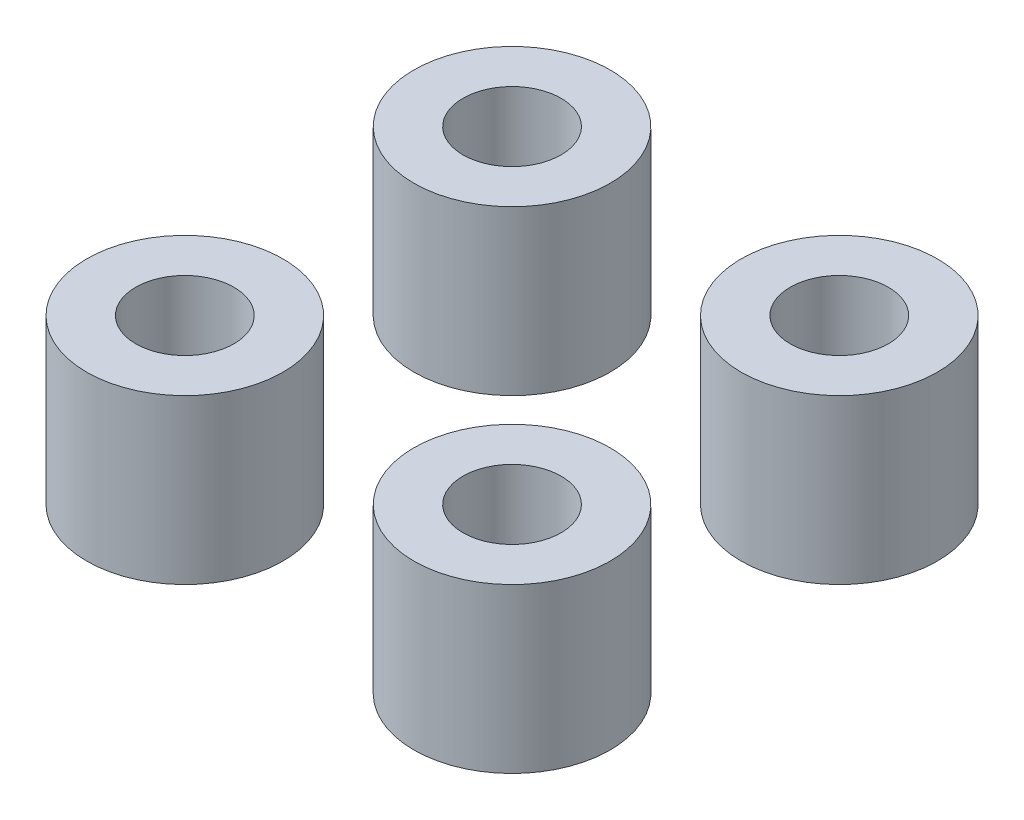
ISO-10303-21;
HEADER;
FILE_DESCRIPTION(('STEP AP214'),'2;1');
FILE_NAME('part.step','',(''),(''),'','','');
FILE_SCHEMA(('AUTOMOTIVE_DESIGN { 1 0 10303 214 1 1 1 1 }'));
ENDSEC;
DATA;
#1=APPLICATION_CONTEXT('core data for automotive mechanical design processes');
#2=APPLICATION_PROTOCOL_DEFINITION('international standard','automotive_design',2000,#1);
#3=PRODUCT_CONTEXT('',#1,'mechanical');
#4=PRODUCT('Part','Part','',(#3));
#5=PRODUCT_RELATED_PRODUCT_CATEGORY('part','',(#4));
#6=PRODUCT_DEFINITION_FORMATION('','',#4);
#7=PRODUCT_DEFINITION_CONTEXT('part definition',#1,'design');
#8=PRODUCT_DEFINITION('design','',#6,#7);
#9=PRODUCT_DEFINITION_SHAPE('','',#8);
#10=(LENGTH_UNIT() NAMED_UNIT(*) SI_UNIT(.MILLI.,.METRE.));
#11=(NAMED_UNIT(*) PLANE_ANGLE_UNIT() SI_UNIT($,.RADIAN.));
#12=(NAMED_UNIT(*) SI_UNIT($,.STERADIAN.) SOLID_ANGLE_UNIT());
#13=UNCERTAINTY_MEASURE_WITH_UNIT(LENGTH_MEASURE(1.E-05),#10,'distance_accuracy_value','');
#14=(GEOMETRIC_REPRESENTATION_CONTEXT(3) GLOBAL_UNCERTAINTY_ASSIGNED_CONTEXT((#13)) GLOBAL_UNIT_ASSIGNED_CONTEXT((#10,
#11,#12)) REPRESENTATION_CONTEXT('',''));
#15=CARTESIAN_POINT('',(0.,0.,0.));
#16=DIRECTION('',(0.,0.,1.));
#17=DIRECTION('',(1.,0.,0.));
#18=AXIS2_PLACEMENT_3D('',#15,#16,#17);
#19=CARTESIAN_POINT('',(20.,10.,0.));
#20=DIRECTION('',(0.,1.,0.));
#21=DIRECTION('',(0.,0.,1.));
#22=AXIS2_PLACEMENT_3D('',#19,#20,#21);
#23=PLANE('',#22);
#24=CARTESIAN_POINT('',(20.,10.,0.));
#25=DIRECTION('',(0.,1.,0.));
#26=DIRECTION('',(0.,0.,1.));
#27=AXIS2_PLACEMENT_3D('',#24,#25,#26);
#28=CIRCLE('',#27,6.);
#29=CARTESIAN_POINT('',(20.,10.,6.));
#30=VERTEX_POINT('',#29);
#31=EDGE_CURVE('E11',#30,#30,#28,.T.);
#32=ORIENTED_EDGE('',*,*,#31,.T.);
#33=EDGE_LOOP('',(#32));
#34=FACE_BOUND('',#33,.T.);
#35=CARTESIAN_POINT('',(20.,10.,0.));
#36=DIRECTION('',(0.,1.,0.));
#37=DIRECTION('',(0.,0.,1.));
#38=AXIS2_PLACEMENT_3D('',#35,#36,#37);
#39=CIRCLE('',#38,3.);
#40=CARTESIAN_POINT('',(20.,10.,3.));
#41=VERTEX_POINT('',#40);
#42=EDGE_CURVE('E53',#41,#41,#39,.T.);
#43=ORIENTED_EDGE('',*,*,#42,.F.);
#44=EDGE_LOOP('',(#43));
#45=FACE_BOUND('',#44,.T.);
#46=ADVANCED_FACE('F42',(#34,#45),#23,.T.);
#47=CARTESIAN_POINT('',(20.,0.,0.));
#48=DIRECTION('',(0.,1.,0.));
#49=DIRECTION('',(0.,0.,1.));
#50=AXIS2_PLACEMENT_3D('',#47,#48,#49);
#51=PLANE('',#50);
#52=CARTESIAN_POINT('',(20.,0.,0.));
#53=DIRECTION('',(0.,1.,0.));
#54=DIRECTION('',(0.,0.,1.));
#55=AXIS2_PLACEMENT_3D('',#52,#53,#54);
#56=CIRCLE('',#55,6.);
#57=CARTESIAN_POINT('',(20.,0.,6.));
#58=VERTEX_POINT('',#57);
#59=EDGE_CURVE('E46',#58,#58,#56,.T.);
#60=ORIENTED_EDGE('',*,*,#59,.F.);
#61=EDGE_LOOP('',(#60));
#62=FACE_BOUND('',#61,.T.);
#63=CARTESIAN_POINT('',(20.,0.,0.));
#64=DIRECTION('',(0.,1.,0.));
#65=DIRECTION('',(0.,0.,1.));
#66=AXIS2_PLACEMENT_3D('',#63,#64,#65);
#67=CIRCLE('',#66,3.);
#68=CARTESIAN_POINT('',(20.,0.,3.));
#69=VERTEX_POINT('',#68);
#70=EDGE_CURVE('E55',#69,#69,#67,.T.);
#71=ORIENTED_EDGE('',*,*,#70,.T.);
#72=EDGE_LOOP('',(#71));
#73=FACE_BOUND('',#72,.T.);
#74=ADVANCED_FACE('F65',(#62,#73),#51,.F.);
#75=CARTESIAN_POINT('',(20.,10.,0.));
#76=DIRECTION('',(0.,-1.,0.));
#77=DIRECTION('',(0.,0.,-1.));
#78=AXIS2_PLACEMENT_3D('',#75,#76,#77);
#79=CYLINDRICAL_SURFACE('',#78,6.);
#80=ORIENTED_EDGE('',*,*,#31,.F.);
#81=EDGE_LOOP('',(#80));
#82=FACE_BOUND('',#81,.T.);
#83=ORIENTED_EDGE('',*,*,#59,.T.);
#84=EDGE_LOOP('',(#83));
#85=FACE_BOUND('',#84,.T.);
#86=ADVANCED_FACE('F44',(#82,#85),#79,.T.);
#87=CARTESIAN_POINT('',(20.,10.,0.));
#88=DIRECTION('',(0.,-1.,0.));
#89=DIRECTION('',(0.,0.,-1.));
#90=AXIS2_PLACEMENT_3D('',#87,#88,#89);
#91=CYLINDRICAL_SURFACE('',#90,3.);
#92=ORIENTED_EDGE('',*,*,#42,.T.);
#93=EDGE_LOOP('',(#92));
#94=FACE_BOUND('',#93,.T.);
#95=ORIENTED_EDGE('',*,*,#70,.F.);
#96=EDGE_LOOP('',(#95));
#97=FACE_BOUND('',#96,.T.);
#98=ADVANCED_FACE('F61',(#94,#97),#91,.F.);
#99=CLOSED_SHELL('',(#46,#74,#86,#98));
#100=MANIFOLD_SOLID_BREP('B2',#99);
#101=CARTESIAN_POINT('',(20.,10.,-20.));
#102=DIRECTION('',(0.,1.,0.));
#103=DIRECTION('',(0.,0.,1.));
#104=AXIS2_PLACEMENT_3D('',#101,#102,#103);
#105=PLANE('',#104);
#106=CARTESIAN_POINT('',(20.,10.,-20.));
#107=DIRECTION('',(0.,1.,0.));
#108=DIRECTION('',(0.,0.,1.));
#109=AXIS2_PLACEMENT_3D('',#106,#107,#108);
#110=CIRCLE('',#109,6.);
#111=CARTESIAN_POINT('',(20.,10.,-14.));
#112=VERTEX_POINT('',#111);
#113=EDGE_CURVE('E41',#112,#112,#110,.T.);
#114=ORIENTED_EDGE('',*,*,#113,.T.);
#115=EDGE_LOOP('',(#114));
#116=FACE_BOUND('',#115,.T.);
#117=CARTESIAN_POINT('',(20.,10.,-20.));
#118=DIRECTION('',(0.,1.,0.));
#119=DIRECTION('',(0.,0.,1.));
#120=AXIS2_PLACEMENT_3D('',#117,#118,#119);
#121=CIRCLE('',#120,3.);
#122=CARTESIAN_POINT('',(20.,10.,-17.));
#123=VERTEX_POINT('',#122);
#124=EDGE_CURVE('E123',#123,#123,#121,.T.);
#125=ORIENTED_EDGE('',*,*,#124,.F.);
#126=EDGE_LOOP('',(#125));
#127=FACE_BOUND('',#126,.T.);
#128=ADVANCED_FACE('F112',(#116,#127),#105,.T.);
#129=CARTESIAN_POINT('',(20.,0.,-20.));
#130=DIRECTION('',(0.,1.,0.));
#131=DIRECTION('',(0.,0.,1.));
#132=AXIS2_PLACEMENT_3D('',#129,#130,#131);
#133=PLANE('',#132);
#134=CARTESIAN_POINT('',(20.,0.,-20.));
#135=DIRECTION('',(0.,1.,0.));
#136=DIRECTION('',(0.,0.,1.));
#137=AXIS2_PLACEMENT_3D('',#134,#135,#136);
#138=CIRCLE('',#137,6.);
#139=CARTESIAN_POINT('',(20.,0.,-14.));
#140=VERTEX_POINT('',#139);
#141=EDGE_CURVE('E116',#140,#140,#138,.T.);
#142=ORIENTED_EDGE('',*,*,#141,.F.);
#143=EDGE_LOOP('',(#142));
#144=FACE_BOUND('',#143,.T.);
#145=CARTESIAN_POINT('',(20.,0.,-20.));
#146=DIRECTION('',(0.,1.,0.));
#147=DIRECTION('',(0.,0.,1.));
#148=AXIS2_PLACEMENT_3D('',#145,#146,#147);
#149=CIRCLE('',#148,3.);
#150=CARTESIAN_POINT('',(20.,0.,-17.));
#151=VERTEX_POINT('',#150);
#152=EDGE_CURVE('E125',#151,#151,#149,.T.);
#153=ORIENTED_EDGE('',*,*,#152,.T.);
#154=EDGE_LOOP('',(#153));
#155=FACE_BOUND('',#154,.T.);
#156=ADVANCED_FACE('F135',(#144,#155),#133,.F.);
#157=CARTESIAN_POINT('',(20.,10.,-20.));
#158=DIRECTION('',(0.,-1.,0.));
#159=DIRECTION('',(0.,0.,-1.));
#160=AXIS2_PLACEMENT_3D('',#157,#158,#159);
#161=CYLINDRICAL_SURFACE('',#160,6.);
#162=ORIENTED_EDGE('',*,*,#113,.F.);
#163=EDGE_LOOP('',(#162));
#164=FACE_BOUND('',#163,.T.);
#165=ORIENTED_EDGE('',*,*,#141,.T.);
#166=EDGE_LOOP('',(#165));
#167=FACE_BOUND('',#166,.T.);
#168=ADVANCED_FACE('F114',(#164,#167),#161,.T.);
#169=CARTESIAN_POINT('',(20.,10.,-20.));
#170=DIRECTION('',(0.,-1.,0.));
#171=DIRECTION('',(0.,0.,-1.));
#172=AXIS2_PLACEMENT_3D('',#169,#170,#171);
#173=CYLINDRICAL_SURFACE('',#172,3.);
#174=ORIENTED_EDGE('',*,*,#124,.T.);
#175=EDGE_LOOP('',(#174));
#176=FACE_BOUND('',#175,.T.);
#177=ORIENTED_EDGE('',*,*,#152,.F.);
#178=EDGE_LOOP('',(#177));
#179=FACE_BOUND('',#178,.T.);
#180=ADVANCED_FACE('F131',(#176,#179),#173,.F.);
#181=CLOSED_SHELL('',(#128,#156,#168,#180));
#182=MANIFOLD_SOLID_BREP('B6',#181);
#183=CARTESIAN_POINT('',(0.,10.,-20.));
#184=DIRECTION('',(0.,1.,0.));
#185=DIRECTION('',(0.,0.,1.));
#186=AXIS2_PLACEMENT_3D('',#183,#184,#185);
#187=PLANE('',#186);
#188=CARTESIAN_POINT('',(0.,10.,-20.));
#189=DIRECTION('',(0.,1.,0.));
#190=DIRECTION('',(0.,0.,1.));
#191=AXIS2_PLACEMENT_3D('',#188,#189,#190);
#192=CIRCLE('',#191,6.);
#193=CARTESIAN_POINT('',(0.,10.,-14.));
#194=VERTEX_POINT('',#193);
#195=EDGE_CURVE('E111',#194,#194,#192,.T.);
#196=ORIENTED_EDGE('',*,*,#195,.T.);
#197=EDGE_LOOP('',(#196));
#198=FACE_BOUND('',#197,.T.);
#199=CARTESIAN_POINT('',(0.,10.,-20.));
#200=DIRECTION('',(0.,1.,0.));
#201=DIRECTION('',(0.,0.,1.));
#202=AXIS2_PLACEMENT_3D('',#199,#200,#201);
#203=CIRCLE('',#202,3.);
#204=CARTESIAN_POINT('',(0.,10.,-17.));
#205=VERTEX_POINT('',#204);
#206=EDGE_CURVE('E192',#205,#205,#203,.T.);
#207=ORIENTED_EDGE('',*,*,#206,.F.);
#208=EDGE_LOOP('',(#207));
#209=FACE_BOUND('',#208,.T.);
#210=ADVANCED_FACE('F181',(#198,#209),#187,.T.);
#211=CARTESIAN_POINT('',(0.,0.,-20.));
#212=DIRECTION('',(0.,1.,0.));
#213=DIRECTION('',(0.,0.,1.));
#214=AXIS2_PLACEMENT_3D('',#211,#212,#213);
#215=PLANE('',#214);
#216=CARTESIAN_POINT('',(0.,0.,-20.));
#217=DIRECTION('',(0.,1.,0.));
#218=DIRECTION('',(0.,0.,1.));
#219=AXIS2_PLACEMENT_3D('',#216,#217,#218);
#220=CIRCLE('',#219,6.);
#221=CARTESIAN_POINT('',(0.,0.,-14.));
#222=VERTEX_POINT('',#221);
#223=EDGE_CURVE('E185',#222,#222,#220,.T.);
#224=ORIENTED_EDGE('',*,*,#223,.F.);
#225=EDGE_LOOP('',(#224));
#226=FACE_BOUND('',#225,.T.);
#227=CARTESIAN_POINT('',(0.,0.,-20.));
#228=DIRECTION('',(0.,1.,0.));
#229=DIRECTION('',(0.,0.,1.));
#230=AXIS2_PLACEMENT_3D('',#227,#228,#229);
#231=CIRCLE('',#230,3.);
#232=CARTESIAN_POINT('',(0.,0.,-17.));
#233=VERTEX_POINT('',#232);
#234=EDGE_CURVE('E194',#233,#233,#231,.T.);
#235=ORIENTED_EDGE('',*,*,#234,.T.);
#236=EDGE_LOOP('',(#235));
#237=FACE_BOUND('',#236,.T.);
#238=ADVANCED_FACE('F204',(#226,#237),#215,.F.);
#239=CARTESIAN_POINT('',(0.,10.,-20.));
#240=DIRECTION('',(0.,-1.,0.));
#241=DIRECTION('',(0.,0.,-1.));
#242=AXIS2_PLACEMENT_3D('',#239,#240,#241);
#243=CYLINDRICAL_SURFACE('',#242,6.);
#244=ORIENTED_EDGE('',*,*,#195,.F.);
#245=EDGE_LOOP('',(#244));
#246=FACE_BOUND('',#245,.T.);
#247=ORIENTED_EDGE('',*,*,#223,.T.);
#248=EDGE_LOOP('',(#247));
#249=FACE_BOUND('',#248,.T.);
#250=ADVANCED_FACE('F183',(#246,#249),#243,.T.);
#251=CARTESIAN_POINT('',(0.,10.,-20.));
#252=DIRECTION('',(0.,-1.,0.));
#253=DIRECTION('',(0.,0.,-1.));
#254=AXIS2_PLACEMENT_3D('',#251,#252,#253);
#255=CYLINDRICAL_SURFACE('',#254,3.);
#256=ORIENTED_EDGE('',*,*,#206,.T.);
#257=EDGE_LOOP('',(#256));
#258=FACE_BOUND('',#257,.T.);
#259=ORIENTED_EDGE('',*,*,#234,.F.);
#260=EDGE_LOOP('',(#259));
#261=FACE_BOUND('',#260,.T.);
#262=ADVANCED_FACE('F200',(#258,#261),#255,.F.);
#263=CLOSED_SHELL('',(#210,#238,#250,#262));
#264=MANIFOLD_SOLID_BREP('B36',#263);
#265=CARTESIAN_POINT('',(0.,10.,0.));
#266=DIRECTION('',(0.,1.,0.));
#267=DIRECTION('',(0.,0.,1.));
#268=AXIS2_PLACEMENT_3D('',#265,#266,#267);
#269=PLANE('',#268);
#270=CARTESIAN_POINT('',(0.,10.,0.));
#271=DIRECTION('',(0.,1.,0.));
#272=DIRECTION('',(0.,0.,1.));
#273=AXIS2_PLACEMENT_3D('',#270,#271,#272);
#274=CIRCLE('',#273,6.);
#275=CARTESIAN_POINT('',(0.,10.,6.));
#276=VERTEX_POINT('',#275);
#277=EDGE_CURVE('E180',#276,#276,#274,.T.);
#278=ORIENTED_EDGE('',*,*,#277,.T.);
#279=EDGE_LOOP('',(#278));
#280=FACE_BOUND('',#279,.T.);
#281=CARTESIAN_POINT('',(0.,10.,0.));
#282=DIRECTION('',(0.,1.,0.));
#283=DIRECTION('',(0.,0.,1.));
#284=AXIS2_PLACEMENT_3D('',#281,#282,#283);
#285=CIRCLE('',#284,3.);
#286=CARTESIAN_POINT('',(0.,10.,3.));
#287=VERTEX_POINT('',#286);
#288=EDGE_CURVE('E254',#287,#287,#285,.T.);
#289=ORIENTED_EDGE('',*,*,#288,.F.);
#290=EDGE_LOOP('',(#289));
#291=FACE_BOUND('',#290,.T.);
#292=ADVANCED_FACE('F243',(#280,#291),#269,.T.);
#293=CARTESIAN_POINT('',(0.,0.,0.));
#294=DIRECTION('',(0.,1.,0.));
#295=DIRECTION('',(0.,0.,1.));
#296=AXIS2_PLACEMENT_3D('',#293,#294,#295);
#297=PLANE('',#296);
#298=CARTESIAN_POINT('',(0.,0.,0.));
#299=DIRECTION('',(0.,1.,0.));
#300=DIRECTION('',(0.,0.,1.));
#301=AXIS2_PLACEMENT_3D('',#298,#299,#300);
#302=CIRCLE('',#301,6.);
#303=CARTESIAN_POINT('',(0.,0.,6.));
#304=VERTEX_POINT('',#303);
#305=EDGE_CURVE('E247',#304,#304,#302,.T.);
#306=ORIENTED_EDGE('',*,*,#305,.F.);
#307=EDGE_LOOP('',(#306));
#308=FACE_BOUND('',#307,.T.);
#309=CARTESIAN_POINT('',(0.,0.,0.));
#310=DIRECTION('',(0.,1.,0.));
#311=DIRECTION('',(0.,0.,1.));
#312=AXIS2_PLACEMENT_3D('',#309,#310,#311);
#313=CIRCLE('',#312,3.);
#314=CARTESIAN_POINT('',(0.,0.,3.));
#315=VERTEX_POINT('',#314);
#316=EDGE_CURVE('E256',#315,#315,#313,.T.);
#317=ORIENTED_EDGE('',*,*,#316,.T.);
#318=EDGE_LOOP('',(#317));
#319=FACE_BOUND('',#318,.T.);
#320=ADVANCED_FACE('F266',(#308,#319),#297,.F.);
#321=CARTESIAN_POINT('',(0.,10.,0.));
#322=DIRECTION('',(0.,-1.,0.));
#323=DIRECTION('',(0.,0.,-1.));
#324=AXIS2_PLACEMENT_3D('',#321,#322,#323);
#325=CYLINDRICAL_SURFACE('',#324,6.);
#326=ORIENTED_EDGE('',*,*,#277,.F.);
#327=EDGE_LOOP('',(#326));
#328=FACE_BOUND('',#327,.T.);
#329=ORIENTED_EDGE('',*,*,#305,.T.);
#330=EDGE_LOOP('',(#329));
#331=FACE_BOUND('',#330,.T.);
#332=ADVANCED_FACE('F245',(#328,#331),#325,.T.);
#333=CARTESIAN_POINT('',(0.,10.,0.));
#334=DIRECTION('',(0.,-1.,0.));
#335=DIRECTION('',(0.,0.,-1.));
#336=AXIS2_PLACEMENT_3D('',#333,#334,#335);
#337=CYLINDRICAL_SURFACE('',#336,3.);
#338=ORIENTED_EDGE('',*,*,#288,.T.);
#339=EDGE_LOOP('',(#338));
#340=FACE_BOUND('',#339,.T.);
#341=ORIENTED_EDGE('',*,*,#316,.F.);
#342=EDGE_LOOP('',(#341));
#343=FACE_BOUND('',#342,.T.);
#344=ADVANCED_FACE('F262',(#340,#343),#337,.F.);
#345=CLOSED_SHELL('',(#292,#320,#332,#344));
#346=MANIFOLD_SOLID_BREP('B106',#345);
#347=ADVANCED_BREP_SHAPE_REPRESENTATION('',(#18,#100,#182,#264,#346),#14);
#348=SHAPE_DEFINITION_REPRESENTATION(#9,#347);
ENDSEC;
END-ISO-10303-21;
